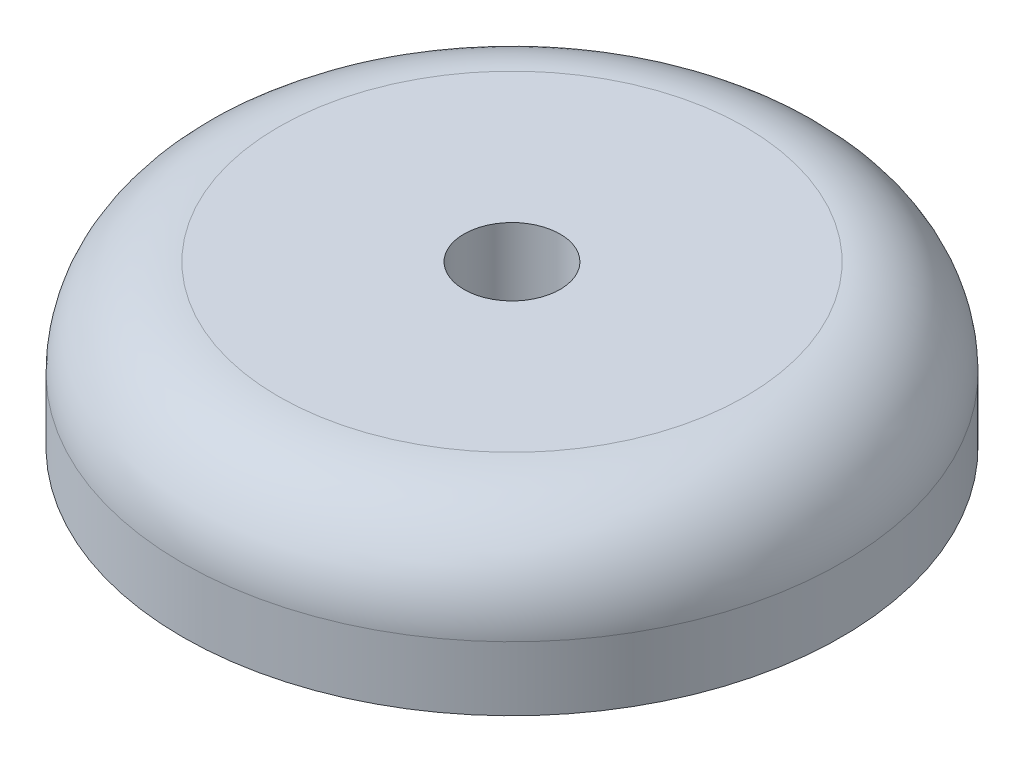
ISO-10303-21;
HEADER;
FILE_DESCRIPTION(('STEP AP214'),'2;1');
FILE_NAME('part.step','',(''),(''),'','','');
FILE_SCHEMA(('AUTOMOTIVE_DESIGN { 1 0 10303 214 1 1 1 1 }'));
ENDSEC;
DATA;
#1=APPLICATION_CONTEXT('core data for automotive mechanical design processes');
#2=APPLICATION_PROTOCOL_DEFINITION('international standard','automotive_design',2000,#1);
#3=PRODUCT_CONTEXT('',#1,'mechanical');
#4=PRODUCT('Part','Part','',(#3));
#5=PRODUCT_RELATED_PRODUCT_CATEGORY('part','',(#4));
#6=PRODUCT_DEFINITION_FORMATION('','',#4);
#7=PRODUCT_DEFINITION_CONTEXT('part definition',#1,'design');
#8=PRODUCT_DEFINITION('design','',#6,#7);
#9=PRODUCT_DEFINITION_SHAPE('','',#8);
#10=(LENGTH_UNIT() NAMED_UNIT(*) SI_UNIT(.MILLI.,.METRE.));
#11=(NAMED_UNIT(*) PLANE_ANGLE_UNIT() SI_UNIT($,.RADIAN.));
#12=(NAMED_UNIT(*) SI_UNIT($,.STERADIAN.) SOLID_ANGLE_UNIT());
#13=UNCERTAINTY_MEASURE_WITH_UNIT(LENGTH_MEASURE(1.E-05),#10,'distance_accuracy_value','');
#14=(GEOMETRIC_REPRESENTATION_CONTEXT(3) GLOBAL_UNCERTAINTY_ASSIGNED_CONTEXT((#13)) GLOBAL_UNIT_ASSIGNED_CONTEXT((#10,
#11,#12)) REPRESENTATION_CONTEXT('',''));
#15=CARTESIAN_POINT('',(0.,0.,0.));
#16=DIRECTION('',(0.,0.,1.));
#17=DIRECTION('',(1.,0.,0.));
#18=AXIS2_PLACEMENT_3D('',#15,#16,#17);
#19=CARTESIAN_POINT('',(0.,5.,0.));
#20=DIRECTION('',(0.,1.,0.));
#21=DIRECTION('',(0.,0.,1.));
#22=AXIS2_PLACEMENT_3D('',#19,#20,#21);
#23=PLANE('',#22);
#24=CARTESIAN_POINT('',(0.,5.,0.));
#25=DIRECTION('',(0.,1.,0.));
#26=DIRECTION('',(0.,0.,1.));
#27=AXIS2_PLACEMENT_3D('',#24,#25,#26);
#28=CIRCLE('',#27,7.287);
#29=CARTESIAN_POINT('',(0.,5.,7.287));
#30=VERTEX_POINT('',#29);
#31=EDGE_CURVE('E38',#30,#30,#28,.T.);
#32=ORIENTED_EDGE('',*,*,#31,.T.);
#33=EDGE_LOOP('',(#32));
#34=FACE_BOUND('',#33,.T.);
#35=CARTESIAN_POINT('',(0.,5.,0.));
#36=DIRECTION('',(0.,1.,0.));
#37=DIRECTION('',(0.,0.,1.));
#38=AXIS2_PLACEMENT_3D('',#35,#36,#37);
#39=CIRCLE('',#38,1.5);
#40=CARTESIAN_POINT('',(0.,5.,1.5));
#41=VERTEX_POINT('',#40);
#42=EDGE_CURVE('E46',#41,#41,#39,.T.);
#43=ORIENTED_EDGE('',*,*,#42,.F.);
#44=EDGE_LOOP('',(#43));
#45=FACE_BOUND('',#44,.T.);
#46=ADVANCED_FACE('F31',(#34,#45),#23,.T.);
#47=CARTESIAN_POINT('',(0.,0.,0.));
#48=DIRECTION('',(0.,1.,0.));
#49=DIRECTION('',(0.,0.,1.));
#50=AXIS2_PLACEMENT_3D('',#47,#48,#49);
#51=PLANE('',#50);
#52=CARTESIAN_POINT('',(0.,0.,0.));
#53=DIRECTION('',(0.,1.,0.));
#54=DIRECTION('',(0.,0.,1.));
#55=AXIS2_PLACEMENT_3D('',#52,#53,#54);
#56=CIRCLE('',#55,10.287);
#57=CARTESIAN_POINT('',(0.,0.,10.287));
#58=VERTEX_POINT('',#57);
#59=EDGE_CURVE('E42',#58,#58,#56,.T.);
#60=ORIENTED_EDGE('',*,*,#59,.F.);
#61=EDGE_LOOP('',(#60));
#62=FACE_BOUND('',#61,.T.);
#63=CARTESIAN_POINT('',(0.,0.,0.));
#64=DIRECTION('',(0.,1.,0.));
#65=DIRECTION('',(0.,0.,1.));
#66=AXIS2_PLACEMENT_3D('',#63,#64,#65);
#67=CIRCLE('',#66,1.5);
#68=CARTESIAN_POINT('',(0.,0.,1.5));
#69=VERTEX_POINT('',#68);
#70=EDGE_CURVE('E49',#69,#69,#67,.T.);
#71=ORIENTED_EDGE('',*,*,#70,.T.);
#72=EDGE_LOOP('',(#71));
#73=FACE_BOUND('',#72,.T.);
#74=ADVANCED_FACE('F59',(#62,#73),#51,.F.);
#75=CARTESIAN_POINT('',(0.,5.,0.));
#76=DIRECTION('',(0.,-1.,0.));
#77=DIRECTION('',(0.,0.,-1.));
#78=AXIS2_PLACEMENT_3D('',#75,#76,#77);
#79=CYLINDRICAL_SURFACE('',#78,10.287);
#80=CARTESIAN_POINT('',(0.,2.,0.));
#81=DIRECTION('',(0.,1.,0.));
#82=DIRECTION('',(0.,0.,1.));
#83=AXIS2_PLACEMENT_3D('',#80,#81,#82);
#84=CIRCLE('',#83,10.287);
#85=CARTESIAN_POINT('',(0.,2.,10.287));
#86=VERTEX_POINT('',#85);
#87=EDGE_CURVE('E10',#86,#86,#84,.F.);
#88=ORIENTED_EDGE('',*,*,#87,.T.);
#89=EDGE_LOOP('',(#88));
#90=FACE_BOUND('',#89,.T.);
#91=ORIENTED_EDGE('',*,*,#59,.T.);
#92=EDGE_LOOP('',(#91));
#93=FACE_BOUND('',#92,.T.);
#94=ADVANCED_FACE('F64',(#90,#93),#79,.T.);
#95=CARTESIAN_POINT('',(0.,5.,0.));
#96=DIRECTION('',(0.,-1.,0.));
#97=DIRECTION('',(0.,0.,-1.));
#98=AXIS2_PLACEMENT_3D('',#95,#96,#97);
#99=CYLINDRICAL_SURFACE('',#98,1.5);
#100=ORIENTED_EDGE('',*,*,#42,.T.);
#101=EDGE_LOOP('',(#100));
#102=FACE_BOUND('',#101,.T.);
#103=ORIENTED_EDGE('',*,*,#70,.F.);
#104=EDGE_LOOP('',(#103));
#105=FACE_BOUND('',#104,.T.);
#106=ADVANCED_FACE('F55',(#102,#105),#99,.F.);
#107=CARTESIAN_POINT('',(0.,2.,0.));
#108=DIRECTION('',(0.,1.,0.));
#109=DIRECTION('',(0.,0.,1.));
#110=AXIS2_PLACEMENT_3D('',#107,#108,#109);
#111=TOROIDAL_SURFACE('',#110,7.287,3.);
#112=ORIENTED_EDGE('',*,*,#87,.F.);
#113=EDGE_LOOP('',(#112));
#114=FACE_BOUND('',#113,.T.);
#115=ORIENTED_EDGE('',*,*,#31,.F.);
#116=EDGE_LOOP('',(#115));
#117=FACE_BOUND('',#116,.T.);
#118=ADVANCED_FACE('F33',(#114,#117),#111,.T.);
#119=CLOSED_SHELL('',(#46,#74,#94,#106,#118));
#120=MANIFOLD_SOLID_BREP('B2',#119);
#121=ADVANCED_BREP_SHAPE_REPRESENTATION('',(#18,#120),#14);
#122=SHAPE_DEFINITION_REPRESENTATION(#9,#121);
ENDSEC;
END-ISO-10303-21;
